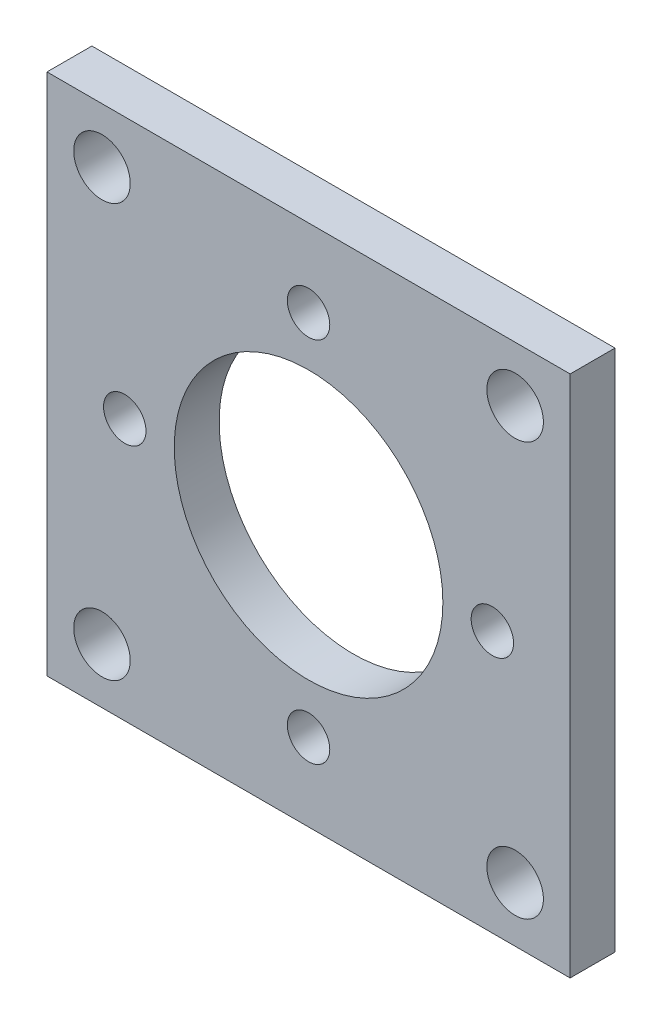
ISO-10303-21;
HEADER;
FILE_DESCRIPTION(('STEP AP214'),'2;1');
FILE_NAME('part.step','',(''),(''),'','','');
FILE_SCHEMA(('AUTOMOTIVE_DESIGN { 1 0 10303 214 1 1 1 1 }'));
ENDSEC;
DATA;
#1=APPLICATION_CONTEXT('core data for automotive mechanical design processes');
#2=APPLICATION_PROTOCOL_DEFINITION('international standard','automotive_design',2000,#1);
#3=PRODUCT_CONTEXT('',#1,'mechanical');
#4=PRODUCT('Part','Part','',(#3));
#5=PRODUCT_RELATED_PRODUCT_CATEGORY('part','',(#4));
#6=PRODUCT_DEFINITION_FORMATION('','',#4);
#7=PRODUCT_DEFINITION_CONTEXT('part definition',#1,'design');
#8=PRODUCT_DEFINITION('design','',#6,#7);
#9=PRODUCT_DEFINITION_SHAPE('','',#8);
#10=(LENGTH_UNIT() NAMED_UNIT(*) SI_UNIT(.MILLI.,.METRE.));
#11=(NAMED_UNIT(*) PLANE_ANGLE_UNIT() SI_UNIT($,.RADIAN.));
#12=(NAMED_UNIT(*) SI_UNIT($,.STERADIAN.) SOLID_ANGLE_UNIT());
#13=UNCERTAINTY_MEASURE_WITH_UNIT(LENGTH_MEASURE(1.E-05),#10,'distance_accuracy_value','');
#14=(GEOMETRIC_REPRESENTATION_CONTEXT(3) GLOBAL_UNCERTAINTY_ASSIGNED_CONTEXT((#13)) GLOBAL_UNIT_ASSIGNED_CONTEXT((#10,
#11,#12)) REPRESENTATION_CONTEXT('',''));
#15=CARTESIAN_POINT('',(0.,0.,0.));
#16=DIRECTION('',(0.,0.,1.));
#17=DIRECTION('',(1.,0.,0.));
#18=AXIS2_PLACEMENT_3D('',#15,#16,#17);
#19=CARTESIAN_POINT('',(18.5,18.5,3.175));
#20=DIRECTION('',(-1.,0.,0.));
#21=DIRECTION('',(0.,0.,1.));
#22=AXIS2_PLACEMENT_3D('',#19,#20,#21);
#23=PLANE('',#22);
#24=DIRECTION('',(0.,1.,0.));
#25=VECTOR('',#24,1.);
#26=CARTESIAN_POINT('',(18.5,18.5,0.));
#27=LINE('',#26,#25);
#28=CARTESIAN_POINT('',(18.5,-18.5,0.));
#29=VERTEX_POINT('',#28);
#30=CARTESIAN_POINT('',(18.5,18.5,0.));
#31=VERTEX_POINT('',#30);
#32=EDGE_CURVE('E100',#29,#31,#27,.T.);
#33=ORIENTED_EDGE('',*,*,#32,.T.);
#34=DIRECTION('',(0.,0.,-1.));
#35=VECTOR('',#34,1.);
#36=CARTESIAN_POINT('',(18.5,18.5,3.175));
#37=LINE('',#36,#35);
#38=CARTESIAN_POINT('',(18.5,18.5,3.175));
#39=VERTEX_POINT('',#38);
#40=EDGE_CURVE('E11',#39,#31,#37,.T.);
#41=ORIENTED_EDGE('',*,*,#40,.F.);
#42=DIRECTION('',(0.,1.,0.));
#43=VECTOR('',#42,1.);
#44=CARTESIAN_POINT('',(18.5,18.5,3.175));
#45=LINE('',#44,#43);
#46=CARTESIAN_POINT('',(18.5,-18.5,3.175));
#47=VERTEX_POINT('',#46);
#48=EDGE_CURVE('E88',#47,#39,#45,.T.);
#49=ORIENTED_EDGE('',*,*,#48,.F.);
#50=DIRECTION('',(0.,0.,-1.));
#51=VECTOR('',#50,1.);
#52=CARTESIAN_POINT('',(18.5,-18.5,3.175));
#53=LINE('',#52,#51);
#54=EDGE_CURVE('E96',#47,#29,#53,.T.);
#55=ORIENTED_EDGE('',*,*,#54,.T.);
#56=EDGE_LOOP('',(#33,#41,#49,#55));
#57=FACE_BOUND('',#56,.T.);
#58=ADVANCED_FACE('F37',(#57),#23,.F.);
#59=CARTESIAN_POINT('',(-18.5,18.5,3.175));
#60=DIRECTION('',(0.,-1.,0.));
#61=DIRECTION('',(0.,0.,-1.));
#62=AXIS2_PLACEMENT_3D('',#59,#60,#61);
#63=PLANE('',#62);
#64=DIRECTION('',(-1.,0.,0.));
#65=VECTOR('',#64,1.);
#66=CARTESIAN_POINT('',(-18.5,18.5,0.));
#67=LINE('',#66,#65);
#68=CARTESIAN_POINT('',(-18.5,18.5,0.));
#69=VERTEX_POINT('',#68);
#70=EDGE_CURVE('E92',#31,#69,#67,.T.);
#71=ORIENTED_EDGE('',*,*,#70,.T.);
#72=DIRECTION('',(0.,0.,-1.));
#73=VECTOR('',#72,1.);
#74=CARTESIAN_POINT('',(-18.5,18.5,3.175));
#75=LINE('',#74,#73);
#76=CARTESIAN_POINT('',(-18.5,18.5,3.175));
#77=VERTEX_POINT('',#76);
#78=EDGE_CURVE('E45',#77,#69,#75,.T.);
#79=ORIENTED_EDGE('',*,*,#78,.F.);
#80=DIRECTION('',(-1.,0.,0.));
#81=VECTOR('',#80,1.);
#82=CARTESIAN_POINT('',(-18.5,18.5,3.175));
#83=LINE('',#82,#81);
#84=EDGE_CURVE('E83',#39,#77,#83,.T.);
#85=ORIENTED_EDGE('',*,*,#84,.F.);
#86=ORIENTED_EDGE('',*,*,#40,.T.);
#87=EDGE_LOOP('',(#71,#79,#85,#86));
#88=FACE_BOUND('',#87,.T.);
#89=ADVANCED_FACE('F91',(#88),#63,.F.);
#90=CARTESIAN_POINT('',(-18.5,18.5,3.175));
#91=DIRECTION('',(1.,0.,0.));
#92=DIRECTION('',(0.,1.,0.));
#93=AXIS2_PLACEMENT_3D('',#90,#91,#92);
#94=PLANE('',#93);
#95=DIRECTION('',(0.,-1.,0.));
#96=VECTOR('',#95,1.);
#97=CARTESIAN_POINT('',(-18.5,18.5,0.));
#98=LINE('',#97,#96);
#99=CARTESIAN_POINT('',(-18.5,-18.5,0.));
#100=VERTEX_POINT('',#99);
#101=EDGE_CURVE('E70',#69,#100,#98,.T.);
#102=ORIENTED_EDGE('',*,*,#101,.T.);
#103=DIRECTION('',(0.,0.,-1.));
#104=VECTOR('',#103,1.);
#105=CARTESIAN_POINT('',(-18.5,-18.5,3.175));
#106=LINE('',#105,#104);
#107=CARTESIAN_POINT('',(-18.5,-18.5,3.175));
#108=VERTEX_POINT('',#107);
#109=EDGE_CURVE('E93',#108,#100,#106,.T.);
#110=ORIENTED_EDGE('',*,*,#109,.F.);
#111=DIRECTION('',(0.,-1.,0.));
#112=VECTOR('',#111,1.);
#113=CARTESIAN_POINT('',(-18.5,18.5,3.175));
#114=LINE('',#113,#112);
#115=EDGE_CURVE('E86',#77,#108,#114,.T.);
#116=ORIENTED_EDGE('',*,*,#115,.F.);
#117=ORIENTED_EDGE('',*,*,#78,.T.);
#118=EDGE_LOOP('',(#102,#110,#116,#117));
#119=FACE_BOUND('',#118,.T.);
#120=ADVANCED_FACE('F94',(#119),#94,.F.);
#121=CARTESIAN_POINT('',(-18.5,-18.5,3.175));
#122=DIRECTION('',(0.,1.,0.));
#123=DIRECTION('',(0.,0.,1.));
#124=AXIS2_PLACEMENT_3D('',#121,#122,#123);
#125=PLANE('',#124);
#126=DIRECTION('',(1.,0.,0.));
#127=VECTOR('',#126,1.);
#128=CARTESIAN_POINT('',(-18.5,-18.5,0.));
#129=LINE('',#128,#127);
#130=EDGE_CURVE('E76',#100,#29,#129,.T.);
#131=ORIENTED_EDGE('',*,*,#130,.T.);
#132=ORIENTED_EDGE('',*,*,#54,.F.);
#133=DIRECTION('',(1.,0.,0.));
#134=VECTOR('',#133,1.);
#135=CARTESIAN_POINT('',(-18.5,-18.5,3.175));
#136=LINE('',#135,#134);
#137=EDGE_CURVE('E53',#108,#47,#136,.T.);
#138=ORIENTED_EDGE('',*,*,#137,.F.);
#139=ORIENTED_EDGE('',*,*,#109,.T.);
#140=EDGE_LOOP('',(#131,#132,#138,#139));
#141=FACE_BOUND('',#140,.T.);
#142=ADVANCED_FACE('F108',(#141),#125,.F.);
#143=CARTESIAN_POINT('',(0.,0.,3.175));
#144=DIRECTION('',(0.,0.,1.));
#145=DIRECTION('',(1.,0.,0.));
#146=AXIS2_PLACEMENT_3D('',#143,#144,#145);
#147=PLANE('',#146);
#148=CARTESIAN_POINT('',(-14.610912703474,-14.610912703474,3.175));
#149=DIRECTION('',(0.,0.,1.));
#150=DIRECTION('',(1.,0.,0.));
#151=AXIS2_PLACEMENT_3D('',#148,#149,#150);
#152=CIRCLE('',#151,2.);
#153=CARTESIAN_POINT('',(-12.610912703474,-14.610912703474,3.175));
#154=VERTEX_POINT('',#153);
#155=EDGE_CURVE('E153',#154,#154,#152,.T.);
#156=ORIENTED_EDGE('',*,*,#155,.F.);
#157=EDGE_LOOP('',(#156));
#158=FACE_BOUND('',#157,.T.);
#159=CARTESIAN_POINT('',(14.610912703474,-14.610912703474,3.175));
#160=DIRECTION('',(0.,0.,1.));
#161=DIRECTION('',(1.,0.,0.));
#162=AXIS2_PLACEMENT_3D('',#159,#160,#161);
#163=CIRCLE('',#162,2.);
#164=CARTESIAN_POINT('',(16.610912703474,-14.610912703474,3.175));
#165=VERTEX_POINT('',#164);
#166=EDGE_CURVE('E159',#165,#165,#163,.T.);
#167=ORIENTED_EDGE('',*,*,#166,.F.);
#168=EDGE_LOOP('',(#167));
#169=FACE_BOUND('',#168,.T.);
#170=CARTESIAN_POINT('',(14.610912703474,14.610912703474,3.175));
#171=DIRECTION('',(0.,0.,1.));
#172=DIRECTION('',(1.,0.,0.));
#173=AXIS2_PLACEMENT_3D('',#170,#171,#172);
#174=CIRCLE('',#173,2.);
#175=CARTESIAN_POINT('',(16.610912703474,14.610912703474,3.175));
#176=VERTEX_POINT('',#175);
#177=EDGE_CURVE('E147',#176,#176,#174,.T.);
#178=ORIENTED_EDGE('',*,*,#177,.F.);
#179=EDGE_LOOP('',(#178));
#180=FACE_BOUND('',#179,.T.);
#181=CARTESIAN_POINT('',(-14.610912703474,14.610912703474,3.175));
#182=DIRECTION('',(0.,0.,1.));
#183=DIRECTION('',(1.,0.,0.));
#184=AXIS2_PLACEMENT_3D('',#181,#182,#183);
#185=CIRCLE('',#184,2.);
#186=CARTESIAN_POINT('',(-12.610912703474,14.610912703474,3.175));
#187=VERTEX_POINT('',#186);
#188=EDGE_CURVE('E144',#187,#187,#185,.T.);
#189=ORIENTED_EDGE('',*,*,#188,.F.);
#190=EDGE_LOOP('',(#189));
#191=FACE_BOUND('',#190,.T.);
#192=CARTESIAN_POINT('',(-13.,0.,3.175));
#193=DIRECTION('',(0.,0.,1.));
#194=DIRECTION('',(1.,0.,0.));
#195=AXIS2_PLACEMENT_3D('',#192,#193,#194);
#196=CIRCLE('',#195,1.5);
#197=CARTESIAN_POINT('',(-11.5,0.,3.175));
#198=VERTEX_POINT('',#197);
#199=EDGE_CURVE('E139',#198,#198,#196,.T.);
#200=ORIENTED_EDGE('',*,*,#199,.F.);
#201=EDGE_LOOP('',(#200));
#202=FACE_BOUND('',#201,.T.);
#203=CARTESIAN_POINT('',(0.,13.,3.175));
#204=DIRECTION('',(0.,0.,1.));
#205=DIRECTION('',(1.,0.,0.));
#206=AXIS2_PLACEMENT_3D('',#203,#204,#205);
#207=CIRCLE('',#206,1.5);
#208=CARTESIAN_POINT('',(1.5,13.,3.175));
#209=VERTEX_POINT('',#208);
#210=EDGE_CURVE('E136',#209,#209,#207,.T.);
#211=ORIENTED_EDGE('',*,*,#210,.F.);
#212=EDGE_LOOP('',(#211));
#213=FACE_BOUND('',#212,.T.);
#214=CARTESIAN_POINT('',(13.,0.,3.175));
#215=DIRECTION('',(0.,0.,1.));
#216=DIRECTION('',(1.,0.,0.));
#217=AXIS2_PLACEMENT_3D('',#214,#215,#216);
#218=CIRCLE('',#217,1.5);
#219=CARTESIAN_POINT('',(14.5,0.,3.175));
#220=VERTEX_POINT('',#219);
#221=EDGE_CURVE('E130',#220,#220,#218,.T.);
#222=ORIENTED_EDGE('',*,*,#221,.F.);
#223=EDGE_LOOP('',(#222));
#224=FACE_BOUND('',#223,.T.);
#225=CARTESIAN_POINT('',(0.,-13.,3.175));
#226=DIRECTION('',(0.,0.,1.));
#227=DIRECTION('',(1.,0.,0.));
#228=AXIS2_PLACEMENT_3D('',#225,#226,#227);
#229=CIRCLE('',#228,1.5);
#230=CARTESIAN_POINT('',(1.5,-13.,3.175));
#231=VERTEX_POINT('',#230);
#232=EDGE_CURVE('E123',#231,#231,#229,.T.);
#233=ORIENTED_EDGE('',*,*,#232,.F.);
#234=EDGE_LOOP('',(#233));
#235=FACE_BOUND('',#234,.T.);
#236=CARTESIAN_POINT('',(0.,0.,3.175));
#237=DIRECTION('',(0.,0.,1.));
#238=DIRECTION('',(1.,0.,0.));
#239=AXIS2_PLACEMENT_3D('',#236,#237,#238);
#240=CIRCLE('',#239,9.5);
#241=CARTESIAN_POINT('',(9.5,0.,3.175));
#242=VERTEX_POINT('',#241);
#243=EDGE_CURVE('E114',#242,#242,#240,.T.);
#244=ORIENTED_EDGE('',*,*,#243,.F.);
#245=EDGE_LOOP('',(#244));
#246=FACE_BOUND('',#245,.T.);
#247=ORIENTED_EDGE('',*,*,#48,.T.);
#248=ORIENTED_EDGE('',*,*,#84,.T.);
#249=ORIENTED_EDGE('',*,*,#115,.T.);
#250=ORIENTED_EDGE('',*,*,#137,.T.);
#251=EDGE_LOOP('',(#247,#248,#249,#250));
#252=FACE_BOUND('',#251,.T.);
#253=ADVANCED_FACE('F84',(#158,#169,#180,#191,#202,#213,#224,#235,#246,#252),#147,.T.);
#254=CARTESIAN_POINT('',(0.,0.,0.));
#255=DIRECTION('',(0.,0.,1.));
#256=DIRECTION('',(1.,0.,0.));
#257=AXIS2_PLACEMENT_3D('',#254,#255,#256);
#258=PLANE('',#257);
#259=CARTESIAN_POINT('',(-14.610912703474,-14.610912703474,0.));
#260=DIRECTION('',(0.,0.,1.));
#261=DIRECTION('',(1.,0.,0.));
#262=AXIS2_PLACEMENT_3D('',#259,#260,#261);
#263=CIRCLE('',#262,2.);
#264=CARTESIAN_POINT('',(-12.610912703474,-14.610912703474,0.));
#265=VERTEX_POINT('',#264);
#266=EDGE_CURVE('E150',#265,#265,#263,.T.);
#267=ORIENTED_EDGE('',*,*,#266,.T.);
#268=EDGE_LOOP('',(#267));
#269=FACE_BOUND('',#268,.T.);
#270=CARTESIAN_POINT('',(14.610912703474,-14.610912703474,0.));
#271=DIRECTION('',(0.,0.,1.));
#272=DIRECTION('',(1.,0.,0.));
#273=AXIS2_PLACEMENT_3D('',#270,#271,#272);
#274=CIRCLE('',#273,2.);
#275=CARTESIAN_POINT('',(16.610912703474,-14.610912703474,0.));
#276=VERTEX_POINT('',#275);
#277=EDGE_CURVE('E156',#276,#276,#274,.T.);
#278=ORIENTED_EDGE('',*,*,#277,.T.);
#279=EDGE_LOOP('',(#278));
#280=FACE_BOUND('',#279,.T.);
#281=CARTESIAN_POINT('',(14.610912703474,14.610912703474,0.));
#282=DIRECTION('',(0.,0.,1.));
#283=DIRECTION('',(1.,0.,0.));
#284=AXIS2_PLACEMENT_3D('',#281,#282,#283);
#285=CIRCLE('',#284,2.);
#286=CARTESIAN_POINT('',(16.610912703474,14.610912703474,0.));
#287=VERTEX_POINT('',#286);
#288=EDGE_CURVE('E162',#287,#287,#285,.T.);
#289=ORIENTED_EDGE('',*,*,#288,.T.);
#290=EDGE_LOOP('',(#289));
#291=FACE_BOUND('',#290,.T.);
#292=CARTESIAN_POINT('',(-14.610912703474,14.610912703474,0.));
#293=DIRECTION('',(0.,0.,1.));
#294=DIRECTION('',(1.,0.,0.));
#295=AXIS2_PLACEMENT_3D('',#292,#293,#294);
#296=CIRCLE('',#295,2.);
#297=CARTESIAN_POINT('',(-12.610912703474,14.610912703474,0.));
#298=VERTEX_POINT('',#297);
#299=EDGE_CURVE('E124',#298,#298,#296,.T.);
#300=ORIENTED_EDGE('',*,*,#299,.T.);
#301=EDGE_LOOP('',(#300));
#302=FACE_BOUND('',#301,.T.);
#303=CARTESIAN_POINT('',(-13.,0.,0.));
#304=DIRECTION('',(0.,0.,1.));
#305=DIRECTION('',(1.,0.,0.));
#306=AXIS2_PLACEMENT_3D('',#303,#304,#305);
#307=CIRCLE('',#306,1.5);
#308=CARTESIAN_POINT('',(-11.5,0.,0.));
#309=VERTEX_POINT('',#308);
#310=EDGE_CURVE('E117',#309,#309,#307,.T.);
#311=ORIENTED_EDGE('',*,*,#310,.T.);
#312=EDGE_LOOP('',(#311));
#313=FACE_BOUND('',#312,.T.);
#314=CARTESIAN_POINT('',(0.,13.,0.));
#315=DIRECTION('',(0.,0.,1.));
#316=DIRECTION('',(1.,0.,0.));
#317=AXIS2_PLACEMENT_3D('',#314,#315,#316);
#318=CIRCLE('',#317,1.5);
#319=CARTESIAN_POINT('',(1.5,13.,0.));
#320=VERTEX_POINT('',#319);
#321=EDGE_CURVE('E133',#320,#320,#318,.T.);
#322=ORIENTED_EDGE('',*,*,#321,.T.);
#323=EDGE_LOOP('',(#322));
#324=FACE_BOUND('',#323,.T.);
#325=CARTESIAN_POINT('',(13.,0.,0.));
#326=DIRECTION('',(0.,0.,1.));
#327=DIRECTION('',(1.,0.,0.));
#328=AXIS2_PLACEMENT_3D('',#325,#326,#327);
#329=CIRCLE('',#328,1.5);
#330=CARTESIAN_POINT('',(14.5,0.,0.));
#331=VERTEX_POINT('',#330);
#332=EDGE_CURVE('E127',#331,#331,#329,.T.);
#333=ORIENTED_EDGE('',*,*,#332,.T.);
#334=EDGE_LOOP('',(#333));
#335=FACE_BOUND('',#334,.T.);
#336=CARTESIAN_POINT('',(0.,-13.,0.));
#337=DIRECTION('',(0.,0.,1.));
#338=DIRECTION('',(1.,0.,0.));
#339=AXIS2_PLACEMENT_3D('',#336,#337,#338);
#340=CIRCLE('',#339,1.5);
#341=CARTESIAN_POINT('',(1.5,-13.,0.));
#342=VERTEX_POINT('',#341);
#343=EDGE_CURVE('E120',#342,#342,#340,.T.);
#344=ORIENTED_EDGE('',*,*,#343,.T.);
#345=EDGE_LOOP('',(#344));
#346=FACE_BOUND('',#345,.T.);
#347=CARTESIAN_POINT('',(0.,0.,0.));
#348=DIRECTION('',(0.,0.,1.));
#349=DIRECTION('',(1.,0.,0.));
#350=AXIS2_PLACEMENT_3D('',#347,#348,#349);
#351=CIRCLE('',#350,9.5);
#352=CARTESIAN_POINT('',(9.5,0.,0.));
#353=VERTEX_POINT('',#352);
#354=EDGE_CURVE('E103',#353,#353,#351,.T.);
#355=ORIENTED_EDGE('',*,*,#354,.T.);
#356=EDGE_LOOP('',(#355));
#357=FACE_BOUND('',#356,.T.);
#358=ORIENTED_EDGE('',*,*,#32,.F.);
#359=ORIENTED_EDGE('',*,*,#130,.F.);
#360=ORIENTED_EDGE('',*,*,#101,.F.);
#361=ORIENTED_EDGE('',*,*,#70,.F.);
#362=EDGE_LOOP('',(#358,#359,#360,#361));
#363=FACE_BOUND('',#362,.T.);
#364=ADVANCED_FACE('F111',(#269,#280,#291,#302,#313,#324,#335,#346,#357,#363),#258,.F.);
#365=CARTESIAN_POINT('',(0.,0.,0.));
#366=DIRECTION('',(0.,0.,1.));
#367=DIRECTION('',(1.,0.,0.));
#368=AXIS2_PLACEMENT_3D('',#365,#366,#367);
#369=CYLINDRICAL_SURFACE('',#368,9.5);
#370=ORIENTED_EDGE('',*,*,#354,.F.);
#371=EDGE_LOOP('',(#370));
#372=FACE_BOUND('',#371,.T.);
#373=ORIENTED_EDGE('',*,*,#243,.T.);
#374=EDGE_LOOP('',(#373));
#375=FACE_BOUND('',#374,.T.);
#376=ADVANCED_FACE('F186',(#372,#375),#369,.F.);
#377=CARTESIAN_POINT('',(0.,-13.,0.));
#378=DIRECTION('',(0.,0.,1.));
#379=DIRECTION('',(1.,0.,0.));
#380=AXIS2_PLACEMENT_3D('',#377,#378,#379);
#381=CYLINDRICAL_SURFACE('',#380,1.5);
#382=ORIENTED_EDGE('',*,*,#343,.F.);
#383=EDGE_LOOP('',(#382));
#384=FACE_BOUND('',#383,.T.);
#385=ORIENTED_EDGE('',*,*,#232,.T.);
#386=EDGE_LOOP('',(#385));
#387=FACE_BOUND('',#386,.T.);
#388=ADVANCED_FACE('F188',(#384,#387),#381,.F.);
#389=CARTESIAN_POINT('',(13.,0.,0.));
#390=DIRECTION('',(0.,0.,1.));
#391=DIRECTION('',(1.,0.,0.));
#392=AXIS2_PLACEMENT_3D('',#389,#390,#391);
#393=CYLINDRICAL_SURFACE('',#392,1.5);
#394=ORIENTED_EDGE('',*,*,#332,.F.);
#395=EDGE_LOOP('',(#394));
#396=FACE_BOUND('',#395,.T.);
#397=ORIENTED_EDGE('',*,*,#221,.T.);
#398=EDGE_LOOP('',(#397));
#399=FACE_BOUND('',#398,.T.);
#400=ADVANCED_FACE('F195',(#396,#399),#393,.F.);
#401=CARTESIAN_POINT('',(0.,13.,0.));
#402=DIRECTION('',(0.,0.,1.));
#403=DIRECTION('',(1.,0.,0.));
#404=AXIS2_PLACEMENT_3D('',#401,#402,#403);
#405=CYLINDRICAL_SURFACE('',#404,1.5);
#406=ORIENTED_EDGE('',*,*,#321,.F.);
#407=EDGE_LOOP('',(#406));
#408=FACE_BOUND('',#407,.T.);
#409=ORIENTED_EDGE('',*,*,#210,.T.);
#410=EDGE_LOOP('',(#409));
#411=FACE_BOUND('',#410,.T.);
#412=ADVANCED_FACE('F283',(#408,#411),#405,.F.);
#413=CARTESIAN_POINT('',(-13.,0.,0.));
#414=DIRECTION('',(0.,0.,1.));
#415=DIRECTION('',(1.,0.,0.));
#416=AXIS2_PLACEMENT_3D('',#413,#414,#415);
#417=CYLINDRICAL_SURFACE('',#416,1.5);
#418=ORIENTED_EDGE('',*,*,#310,.F.);
#419=EDGE_LOOP('',(#418));
#420=FACE_BOUND('',#419,.T.);
#421=ORIENTED_EDGE('',*,*,#199,.T.);
#422=EDGE_LOOP('',(#421));
#423=FACE_BOUND('',#422,.T.);
#424=ADVANCED_FACE('F236',(#420,#423),#417,.F.);
#425=CARTESIAN_POINT('',(-14.610912703474,14.610912703474,0.));
#426=DIRECTION('',(0.,0.,1.));
#427=DIRECTION('',(1.,0.,0.));
#428=AXIS2_PLACEMENT_3D('',#425,#426,#427);
#429=CYLINDRICAL_SURFACE('',#428,2.);
#430=ORIENTED_EDGE('',*,*,#299,.F.);
#431=EDGE_LOOP('',(#430));
#432=FACE_BOUND('',#431,.T.);
#433=ORIENTED_EDGE('',*,*,#188,.T.);
#434=EDGE_LOOP('',(#433));
#435=FACE_BOUND('',#434,.T.);
#436=ADVANCED_FACE('F231',(#432,#435),#429,.F.);
#437=CARTESIAN_POINT('',(14.610912703474,14.610912703474,0.));
#438=DIRECTION('',(0.,0.,1.));
#439=DIRECTION('',(1.,0.,0.));
#440=AXIS2_PLACEMENT_3D('',#437,#438,#439);
#441=CYLINDRICAL_SURFACE('',#440,2.);
#442=ORIENTED_EDGE('',*,*,#288,.F.);
#443=EDGE_LOOP('',(#442));
#444=FACE_BOUND('',#443,.T.);
#445=ORIENTED_EDGE('',*,*,#177,.T.);
#446=EDGE_LOOP('',(#445));
#447=FACE_BOUND('',#446,.T.);
#448=ADVANCED_FACE('F168',(#444,#447),#441,.F.);
#449=CARTESIAN_POINT('',(14.610912703474,-14.610912703474,0.));
#450=DIRECTION('',(0.,0.,1.));
#451=DIRECTION('',(1.,0.,0.));
#452=AXIS2_PLACEMENT_3D('',#449,#450,#451);
#453=CYLINDRICAL_SURFACE('',#452,2.);
#454=ORIENTED_EDGE('',*,*,#277,.F.);
#455=EDGE_LOOP('',(#454));
#456=FACE_BOUND('',#455,.T.);
#457=ORIENTED_EDGE('',*,*,#166,.T.);
#458=EDGE_LOOP('',(#457));
#459=FACE_BOUND('',#458,.T.);
#460=ADVANCED_FACE('F249',(#456,#459),#453,.F.);
#461=CARTESIAN_POINT('',(-14.610912703474,-14.610912703474,0.));
#462=DIRECTION('',(0.,0.,1.));
#463=DIRECTION('',(1.,0.,0.));
#464=AXIS2_PLACEMENT_3D('',#461,#462,#463);
#465=CYLINDRICAL_SURFACE('',#464,2.);
#466=ORIENTED_EDGE('',*,*,#266,.F.);
#467=EDGE_LOOP('',(#466));
#468=FACE_BOUND('',#467,.T.);
#469=ORIENTED_EDGE('',*,*,#155,.T.);
#470=EDGE_LOOP('',(#469));
#471=FACE_BOUND('',#470,.T.);
#472=ADVANCED_FACE('F260',(#468,#471),#465,.F.);
#473=CLOSED_SHELL('',(#58,#89,#120,#142,#253,#364,#376,#388,#400,#412,#424,#436,#448,#460,#472));
#474=MANIFOLD_SOLID_BREP('B2',#473);
#475=ADVANCED_BREP_SHAPE_REPRESENTATION('',(#18,#474),#14);
#476=SHAPE_DEFINITION_REPRESENTATION(#9,#475);
ENDSEC;
END-ISO-10303-21;
